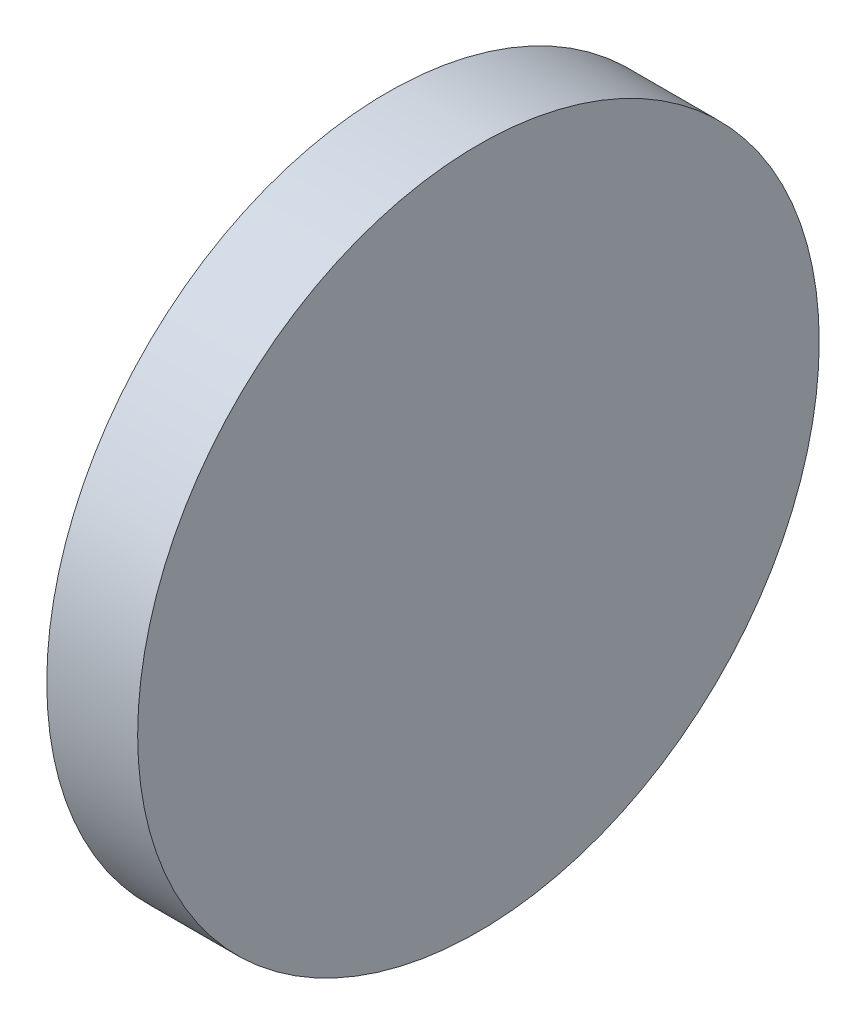
ISO-10303-21;
HEADER;
FILE_DESCRIPTION(('STEP AP214'),'2;1');
FILE_NAME('part.step','',(''),(''),'','','');
FILE_SCHEMA(('AUTOMOTIVE_DESIGN { 1 0 10303 214 1 1 1 1 }'));
ENDSEC;
DATA;
#1=APPLICATION_CONTEXT('core data for automotive mechanical design processes');
#2=APPLICATION_PROTOCOL_DEFINITION('international standard','automotive_design',2000,#1);
#3=PRODUCT_CONTEXT('',#1,'mechanical');
#4=PRODUCT('Part','Part','',(#3));
#5=PRODUCT_RELATED_PRODUCT_CATEGORY('part','',(#4));
#6=PRODUCT_DEFINITION_FORMATION('','',#4);
#7=PRODUCT_DEFINITION_CONTEXT('part definition',#1,'design');
#8=PRODUCT_DEFINITION('design','',#6,#7);
#9=PRODUCT_DEFINITION_SHAPE('','',#8);
#10=(LENGTH_UNIT() NAMED_UNIT(*) SI_UNIT(.MILLI.,.METRE.));
#11=(NAMED_UNIT(*) PLANE_ANGLE_UNIT() SI_UNIT($,.RADIAN.));
#12=(NAMED_UNIT(*) SI_UNIT($,.STERADIAN.) SOLID_ANGLE_UNIT());
#13=UNCERTAINTY_MEASURE_WITH_UNIT(LENGTH_MEASURE(1.E-05),#10,'distance_accuracy_value','');
#14=(GEOMETRIC_REPRESENTATION_CONTEXT(3) GLOBAL_UNCERTAINTY_ASSIGNED_CONTEXT((#13)) GLOBAL_UNIT_ASSIGNED_CONTEXT((#10,
#11,#12)) REPRESENTATION_CONTEXT('',''));
#15=CARTESIAN_POINT('',(0.,0.,0.));
#16=DIRECTION('',(0.,0.,1.));
#17=DIRECTION('',(1.,0.,0.));
#18=AXIS2_PLACEMENT_3D('',#15,#16,#17);
#19=CARTESIAN_POINT('',(2.,0.,0.));
#20=DIRECTION('',(-1.,0.,0.));
#21=DIRECTION('',(0.,0.,1.));
#22=AXIS2_PLACEMENT_3D('',#19,#20,#21);
#23=CYLINDRICAL_SURFACE('',#22,7.5);
#24=CARTESIAN_POINT('',(2.,0.,0.));
#25=DIRECTION('',(1.,0.,0.));
#26=DIRECTION('',(0.,0.,-1.));
#27=AXIS2_PLACEMENT_3D('',#24,#25,#26);
#28=CIRCLE('',#27,7.5);
#29=CARTESIAN_POINT('',(2.,0.,-7.5));
#30=VERTEX_POINT('',#29);
#31=EDGE_CURVE('E10',#30,#30,#28,.T.);
#32=ORIENTED_EDGE('',*,*,#31,.F.);
#33=EDGE_LOOP('',(#32));
#34=FACE_BOUND('',#33,.T.);
#35=CARTESIAN_POINT('',(0.,0.,0.));
#36=DIRECTION('',(1.,0.,0.));
#37=DIRECTION('',(0.,0.,-1.));
#38=AXIS2_PLACEMENT_3D('',#35,#36,#37);
#39=CIRCLE('',#38,7.5);
#40=CARTESIAN_POINT('',(0.,0.,-7.5));
#41=VERTEX_POINT('',#40);
#42=EDGE_CURVE('E39',#41,#41,#39,.T.);
#43=ORIENTED_EDGE('',*,*,#42,.T.);
#44=EDGE_LOOP('',(#43));
#45=FACE_BOUND('',#44,.T.);
#46=ADVANCED_FACE('F36',(#34,#45),#23,.T.);
#47=CARTESIAN_POINT('',(2.,0.,0.));
#48=DIRECTION('',(1.,0.,0.));
#49=DIRECTION('',(0.,0.,-1.));
#50=AXIS2_PLACEMENT_3D('',#47,#48,#49);
#51=PLANE('',#50);
#52=ORIENTED_EDGE('',*,*,#31,.T.);
#53=EDGE_LOOP('',(#52));
#54=FACE_BOUND('',#53,.T.);
#55=ADVANCED_FACE('F51',(#54),#51,.T.);
#56=CARTESIAN_POINT('',(0.,0.,0.));
#57=DIRECTION('',(1.,0.,0.));
#58=DIRECTION('',(0.,0.,-1.));
#59=AXIS2_PLACEMENT_3D('',#56,#57,#58);
#60=PLANE('',#59);
#61=ORIENTED_EDGE('',*,*,#42,.F.);
#62=EDGE_LOOP('',(#61));
#63=FACE_BOUND('',#62,.T.);
#64=ADVANCED_FACE('F49',(#63),#60,.F.);
#65=CLOSED_SHELL('',(#46,#55,#64));
#66=MANIFOLD_SOLID_BREP('B2',#65);
#67=ADVANCED_BREP_SHAPE_REPRESENTATION('',(#18,#66),#14);
#68=SHAPE_DEFINITION_REPRESENTATION(#9,#67);
ENDSEC;
END-ISO-10303-21;
